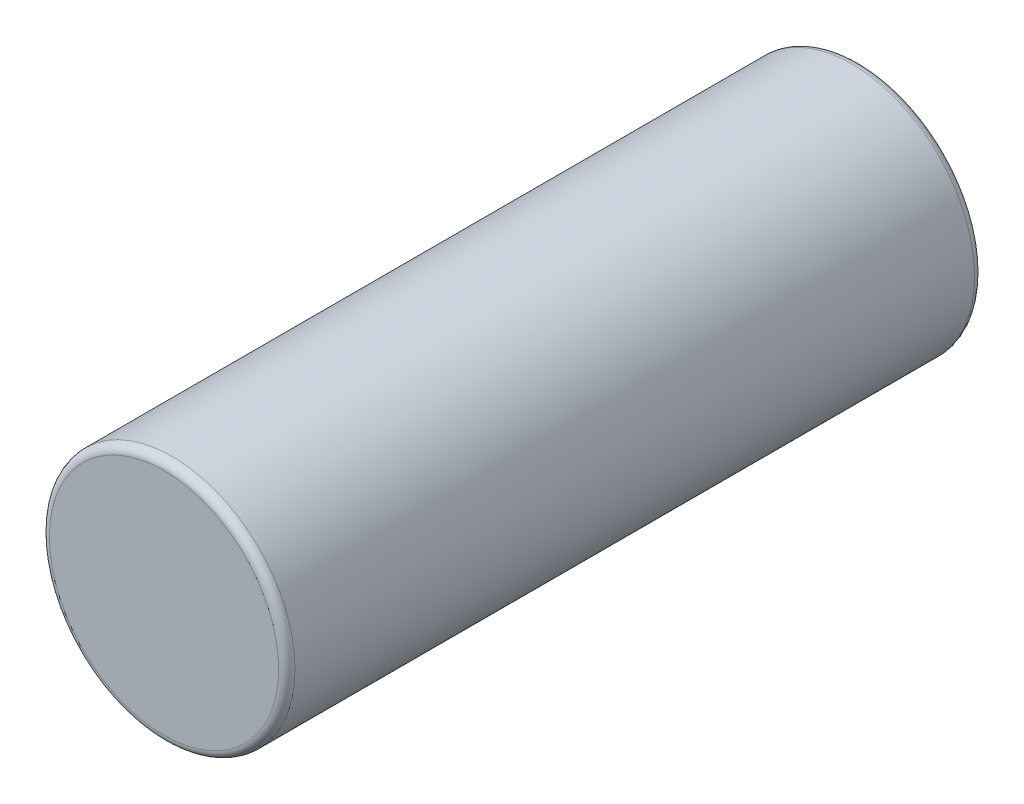
ISO-10303-21;
HEADER;
FILE_DESCRIPTION(('STEP AP214'),'2;1');
FILE_NAME('part.step','',(''),(''),'','','');
FILE_SCHEMA(('AUTOMOTIVE_DESIGN { 1 0 10303 214 1 1 1 1 }'));
ENDSEC;
DATA;
#1=APPLICATION_CONTEXT('core data for automotive mechanical design processes');
#2=APPLICATION_PROTOCOL_DEFINITION('international standard','automotive_design',2000,#1);
#3=PRODUCT_CONTEXT('',#1,'mechanical');
#4=PRODUCT('Part','Part','',(#3));
#5=PRODUCT_RELATED_PRODUCT_CATEGORY('part','',(#4));
#6=PRODUCT_DEFINITION_FORMATION('','',#4);
#7=PRODUCT_DEFINITION_CONTEXT('part definition',#1,'design');
#8=PRODUCT_DEFINITION('design','',#6,#7);
#9=PRODUCT_DEFINITION_SHAPE('','',#8);
#10=(LENGTH_UNIT() NAMED_UNIT(*) SI_UNIT(.MILLI.,.METRE.));
#11=(NAMED_UNIT(*) PLANE_ANGLE_UNIT() SI_UNIT($,.RADIAN.));
#12=(NAMED_UNIT(*) SI_UNIT($,.STERADIAN.) SOLID_ANGLE_UNIT());
#13=UNCERTAINTY_MEASURE_WITH_UNIT(LENGTH_MEASURE(1.E-05),#10,'distance_accuracy_value','');
#14=(GEOMETRIC_REPRESENTATION_CONTEXT(3) GLOBAL_UNCERTAINTY_ASSIGNED_CONTEXT((#13)) GLOBAL_UNIT_ASSIGNED_CONTEXT((#10,
#11,#12)) REPRESENTATION_CONTEXT('',''));
#15=CARTESIAN_POINT('',(0.,0.,0.));
#16=DIRECTION('',(0.,0.,1.));
#17=DIRECTION('',(1.,0.,0.));
#18=AXIS2_PLACEMENT_3D('',#15,#16,#17);
#19=CARTESIAN_POINT('',(0.,0.,8.5));
#20=DIRECTION('',(0.,0.,-1.));
#21=DIRECTION('',(-1.,0.,0.));
#22=AXIS2_PLACEMENT_3D('',#19,#20,#21);
#23=CYLINDRICAL_SURFACE('',#22,1.5);
#24=CARTESIAN_POINT('',(0.,0.,8.4));
#25=DIRECTION('',(0.,0.,1.));
#26=DIRECTION('',(1.,0.,0.));
#27=AXIS2_PLACEMENT_3D('',#24,#25,#26);
#28=CIRCLE('',#27,1.5);
#29=CARTESIAN_POINT('',(1.5,0.,8.4));
#30=VERTEX_POINT('',#29);
#31=EDGE_CURVE('E42',#30,#30,#28,.F.);
#32=ORIENTED_EDGE('',*,*,#31,.T.);
#33=EDGE_LOOP('',(#32));
#34=FACE_BOUND('',#33,.T.);
#35=CARTESIAN_POINT('',(0.,0.,0.0999999999999994));
#36=DIRECTION('',(0.,0.,1.));
#37=DIRECTION('',(1.,0.,0.));
#38=AXIS2_PLACEMENT_3D('',#35,#36,#37);
#39=CIRCLE('',#38,1.5);
#40=CARTESIAN_POINT('',(1.5,0.,0.0999999999999994));
#41=VERTEX_POINT('',#40);
#42=EDGE_CURVE('E46',#41,#41,#39,.T.);
#43=ORIENTED_EDGE('',*,*,#42,.T.);
#44=EDGE_LOOP('',(#43));
#45=FACE_BOUND('',#44,.T.);
#46=ADVANCED_FACE('F35',(#34,#45),#23,.T.);
#47=CARTESIAN_POINT('',(0.,0.,8.5));
#48=DIRECTION('',(0.,0.,1.));
#49=DIRECTION('',(1.,0.,0.));
#50=AXIS2_PLACEMENT_3D('',#47,#48,#49);
#51=PLANE('',#50);
#52=CARTESIAN_POINT('',(0.,0.,8.5));
#53=DIRECTION('',(0.,0.,1.));
#54=DIRECTION('',(1.,0.,0.));
#55=AXIS2_PLACEMENT_3D('',#52,#53,#54);
#56=CIRCLE('',#55,1.4);
#57=CARTESIAN_POINT('',(1.4,0.,8.5));
#58=VERTEX_POINT('',#57);
#59=EDGE_CURVE('E50',#58,#58,#56,.T.);
#60=ORIENTED_EDGE('',*,*,#59,.T.);
#61=EDGE_LOOP('',(#60));
#62=FACE_BOUND('',#61,.T.);
#63=ADVANCED_FACE('F56',(#62),#51,.T.);
#64=CARTESIAN_POINT('',(0.,0.,0.));
#65=DIRECTION('',(0.,0.,1.));
#66=DIRECTION('',(1.,0.,0.));
#67=AXIS2_PLACEMENT_3D('',#64,#65,#66);
#68=PLANE('',#67);
#69=CARTESIAN_POINT('',(0.,0.,0.));
#70=DIRECTION('',(0.,0.,1.));
#71=DIRECTION('',(1.,0.,0.));
#72=AXIS2_PLACEMENT_3D('',#69,#70,#71);
#73=CIRCLE('',#72,1.4);
#74=CARTESIAN_POINT('',(1.4,0.,0.));
#75=VERTEX_POINT('',#74);
#76=EDGE_CURVE('E10',#75,#75,#73,.F.);
#77=ORIENTED_EDGE('',*,*,#76,.T.);
#78=EDGE_LOOP('',(#77));
#79=FACE_BOUND('',#78,.T.);
#80=ADVANCED_FACE('F60',(#79),#68,.F.);
#81=CARTESIAN_POINT('',(0.,0.,8.4));
#82=DIRECTION('',(0.,0.,1.));
#83=DIRECTION('',(1.,0.,0.));
#84=AXIS2_PLACEMENT_3D('',#81,#82,#83);
#85=TOROIDAL_SURFACE('',#84,1.4,0.1);
#86=ORIENTED_EDGE('',*,*,#31,.F.);
#87=EDGE_LOOP('',(#86));
#88=FACE_BOUND('',#87,.T.);
#89=ORIENTED_EDGE('',*,*,#59,.F.);
#90=EDGE_LOOP('',(#89));
#91=FACE_BOUND('',#90,.T.);
#92=ADVANCED_FACE('F58',(#88,#91),#85,.T.);
#93=CARTESIAN_POINT('',(0.,0.,0.0999999999999994));
#94=DIRECTION('',(0.,0.,1.));
#95=DIRECTION('',(1.,0.,0.));
#96=AXIS2_PLACEMENT_3D('',#93,#94,#95);
#97=TOROIDAL_SURFACE('',#96,1.4,0.1);
#98=ORIENTED_EDGE('',*,*,#76,.F.);
#99=EDGE_LOOP('',(#98));
#100=FACE_BOUND('',#99,.T.);
#101=ORIENTED_EDGE('',*,*,#42,.F.);
#102=EDGE_LOOP('',(#101));
#103=FACE_BOUND('',#102,.T.);
#104=ADVANCED_FACE('F37',(#100,#103),#97,.T.);
#105=CLOSED_SHELL('',(#46,#63,#80,#92,#104));
#106=MANIFOLD_SOLID_BREP('B2',#105);
#107=ADVANCED_BREP_SHAPE_REPRESENTATION('',(#18,#106),#14);
#108=SHAPE_DEFINITION_REPRESENTATION(#9,#107);
ENDSEC;
END-ISO-10303-21;
